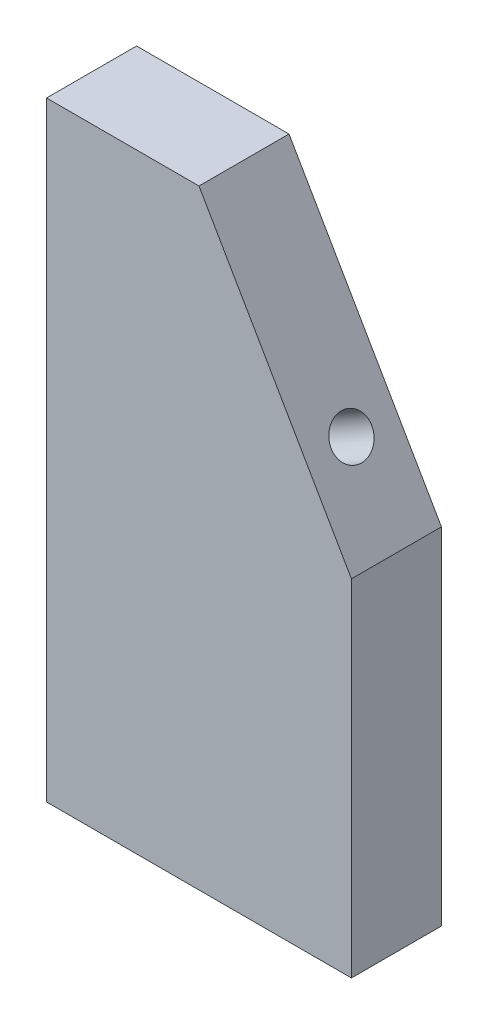
ISO-10303-21;
HEADER;
FILE_DESCRIPTION(('STEP AP214'),'2;1');
FILE_NAME('part.step','',(''),(''),'','','');
FILE_SCHEMA(('AUTOMOTIVE_DESIGN { 1 0 10303 214 1 1 1 1 }'));
ENDSEC;
DATA;
#1=APPLICATION_CONTEXT('core data for automotive mechanical design processes');
#2=APPLICATION_PROTOCOL_DEFINITION('international standard','automotive_design',2000,#1);
#3=PRODUCT_CONTEXT('',#1,'mechanical');
#4=PRODUCT('Part','Part','',(#3));
#5=PRODUCT_RELATED_PRODUCT_CATEGORY('part','',(#4));
#6=PRODUCT_DEFINITION_FORMATION('','',#4);
#7=PRODUCT_DEFINITION_CONTEXT('part definition',#1,'design');
#8=PRODUCT_DEFINITION('design','',#6,#7);
#9=PRODUCT_DEFINITION_SHAPE('','',#8);
#10=(LENGTH_UNIT() NAMED_UNIT(*) SI_UNIT(.MILLI.,.METRE.));
#11=(NAMED_UNIT(*) PLANE_ANGLE_UNIT() SI_UNIT($,.RADIAN.));
#12=(NAMED_UNIT(*) SI_UNIT($,.STERADIAN.) SOLID_ANGLE_UNIT());
#13=UNCERTAINTY_MEASURE_WITH_UNIT(LENGTH_MEASURE(1.E-05),#10,'distance_accuracy_value','');
#14=(GEOMETRIC_REPRESENTATION_CONTEXT(3) GLOBAL_UNCERTAINTY_ASSIGNED_CONTEXT((#13)) GLOBAL_UNIT_ASSIGNED_CONTEXT((#10,
#11,#12)) REPRESENTATION_CONTEXT('',''));
#15=CARTESIAN_POINT('',(0.,0.,0.));
#16=DIRECTION('',(0.,0.,1.));
#17=DIRECTION('',(1.,0.,0.));
#18=AXIS2_PLACEMENT_3D('',#15,#16,#17);
#19=CARTESIAN_POINT('',(-34.7225009252407,-8.10295474387528,-5.85));
#20=DIRECTION('',(0.866025403784439,0.,-0.499999999999998));
#21=DIRECTION('',(-0.499999999999999,0.,-0.86602540378444));
#22=AXIS2_PLACEMENT_3D('',#19,#20,#21);
#23=PLANE('',#22);
#24=DIRECTION('',(0.499999999999999,0.,0.86602540378444));
#25=VECTOR('',#24,1.);
#26=CARTESIAN_POINT('',(-34.7225009252407,-13.8029547438753,-5.85));
#27=LINE('',#26,#25);
#28=CARTESIAN_POINT('',(-34.7225009252407,-13.8029547438753,-5.85));
#29=VERTEX_POINT('',#28);
#30=CARTESIAN_POINT('',(-31.3450018504814,-13.8029547438753,0.));
#31=VERTEX_POINT('',#30);
#32=EDGE_CURVE('E531',#29,#31,#27,.T.);
#33=ORIENTED_EDGE('',*,*,#32,.T.);
#34=DIRECTION('',(0.,-1.,0.));
#35=VECTOR('',#34,1.);
#36=CARTESIAN_POINT('',(-31.3450018504814,-8.10295474387528,0.));
#37=LINE('',#36,#35);
#38=CARTESIAN_POINT('',(-31.3450018504814,-8.10295474387528,0.));
#39=VERTEX_POINT('',#38);
#40=EDGE_CURVE('E530',#39,#31,#37,.T.);
#41=ORIENTED_EDGE('',*,*,#40,.F.);
#42=DIRECTION('',(0.499999999999999,0.,0.86602540378444));
#43=VECTOR('',#42,1.);
#44=CARTESIAN_POINT('',(-34.7225009252407,-8.10295474387528,-5.85));
#45=LINE('',#44,#43);
#46=CARTESIAN_POINT('',(-34.7225009252407,-8.10295474387528,-5.85));
#47=VERTEX_POINT('',#46);
#48=EDGE_CURVE('E505',#47,#39,#45,.T.);
#49=ORIENTED_EDGE('',*,*,#48,.F.);
#50=DIRECTION('',(0.,-1.,0.));
#51=VECTOR('',#50,1.);
#52=CARTESIAN_POINT('',(-34.7225009252407,-8.10295474387528,-5.85));
#53=LINE('',#52,#51);
#54=EDGE_CURVE('E554',#47,#29,#53,.T.);
#55=ORIENTED_EDGE('',*,*,#54,.T.);
#56=EDGE_LOOP('',(#33,#41,#49,#55));
#57=FACE_BOUND('',#56,.T.);
#58=ADVANCED_FACE('F38',(#57),#23,.F.);
#59=CARTESIAN_POINT('',(-41.4774990747593,-8.10295474387528,-5.85));
#60=DIRECTION('',(0.,0.,-1.));
#61=DIRECTION('',(-1.,0.,0.));
#62=AXIS2_PLACEMENT_3D('',#59,#60,#61);
#63=PLANE('',#62);
#64=DIRECTION('',(1.,0.,0.));
#65=VECTOR('',#64,1.);
#66=CARTESIAN_POINT('',(-41.4774990747593,-13.8029547438753,-5.85));
#67=LINE('',#66,#65);
#68=CARTESIAN_POINT('',(-41.4774990747593,-13.8029547438753,-5.85));
#69=VERTEX_POINT('',#68);
#70=EDGE_CURVE('E510',#69,#29,#67,.T.);
#71=ORIENTED_EDGE('',*,*,#70,.T.);
#72=ORIENTED_EDGE('',*,*,#54,.F.);
#73=DIRECTION('',(1.,0.,0.));
#74=VECTOR('',#73,1.);
#75=CARTESIAN_POINT('',(-41.4774990747593,-8.10295474387528,-5.85));
#76=LINE('',#75,#74);
#77=CARTESIAN_POINT('',(-41.4774990747593,-8.10295474387528,-5.85));
#78=VERTEX_POINT('',#77);
#79=EDGE_CURVE('E526',#78,#47,#76,.T.);
#80=ORIENTED_EDGE('',*,*,#79,.F.);
#81=DIRECTION('',(0.,-1.,0.));
#82=VECTOR('',#81,1.);
#83=CARTESIAN_POINT('',(-41.4774990747593,-8.10295474387528,-5.85));
#84=LINE('',#83,#82);
#85=EDGE_CURVE('E559',#78,#69,#84,.T.);
#86=ORIENTED_EDGE('',*,*,#85,.T.);
#87=EDGE_LOOP('',(#71,#72,#80,#86));
#88=FACE_BOUND('',#87,.T.);
#89=ADVANCED_FACE('F161',(#88),#63,.F.);
#90=CARTESIAN_POINT('',(-44.8549981495186,-8.10295474387528,0.));
#91=DIRECTION('',(-0.866025403784438,0.,-0.500000000000001));
#92=DIRECTION('',(-0.500000000000001,0.,0.866025403784438));
#93=AXIS2_PLACEMENT_3D('',#90,#91,#92);
#94=PLANE('',#93);
#95=DIRECTION('',(0.500000000000001,0.,-0.866025403784438));
#96=VECTOR('',#95,1.);
#97=CARTESIAN_POINT('',(-44.8549981495186,-13.8029547438753,0.));
#98=LINE('',#97,#96);
#99=CARTESIAN_POINT('',(-44.8549981495186,-13.8029547438753,0.));
#100=VERTEX_POINT('',#99);
#101=EDGE_CURVE('E547',#100,#69,#98,.T.);
#102=ORIENTED_EDGE('',*,*,#101,.T.);
#103=ORIENTED_EDGE('',*,*,#85,.F.);
#104=DIRECTION('',(0.500000000000001,0.,-0.866025403784438));
#105=VECTOR('',#104,1.);
#106=CARTESIAN_POINT('',(-44.8549981495186,-8.10295474387528,0.));
#107=LINE('',#106,#105);
#108=CARTESIAN_POINT('',(-44.8549981495186,-8.10295474387528,0.));
#109=VERTEX_POINT('',#108);
#110=EDGE_CURVE('E522',#109,#78,#107,.T.);
#111=ORIENTED_EDGE('',*,*,#110,.F.);
#112=DIRECTION('',(0.,-1.,0.));
#113=VECTOR('',#112,1.);
#114=CARTESIAN_POINT('',(-44.8549981495186,-8.10295474387528,0.));
#115=LINE('',#114,#113);
#116=EDGE_CURVE('E563',#109,#100,#115,.T.);
#117=ORIENTED_EDGE('',*,*,#116,.T.);
#118=EDGE_LOOP('',(#102,#103,#111,#117));
#119=FACE_BOUND('',#118,.T.);
#120=ADVANCED_FACE('F167',(#119),#94,.F.);
#121=CARTESIAN_POINT('',(-41.4774990747593,-8.10295474387528,5.84999999999999));
#122=DIRECTION('',(-0.866025403784439,0.,0.499999999999999));
#123=DIRECTION('',(0.499999999999999,0.,0.866025403784439));
#124=AXIS2_PLACEMENT_3D('',#121,#122,#123);
#125=PLANE('',#124);
#126=DIRECTION('',(-0.499999999999999,0.,-0.866025403784439));
#127=VECTOR('',#126,1.);
#128=CARTESIAN_POINT('',(-41.4774990747593,-13.8029547438753,5.84999999999999));
#129=LINE('',#128,#127);
#130=CARTESIAN_POINT('',(-41.4774990747593,-13.8029547438753,5.84999999999999));
#131=VERTEX_POINT('',#130);
#132=EDGE_CURVE('E543',#131,#100,#129,.T.);
#133=ORIENTED_EDGE('',*,*,#132,.T.);
#134=ORIENTED_EDGE('',*,*,#116,.F.);
#135=DIRECTION('',(-0.499999999999999,0.,-0.866025403784439));
#136=VECTOR('',#135,1.);
#137=CARTESIAN_POINT('',(-41.4774990747593,-8.10295474387528,5.84999999999999));
#138=LINE('',#137,#136);
#139=CARTESIAN_POINT('',(-41.4774990747593,-8.10295474387528,5.84999999999999));
#140=VERTEX_POINT('',#139);
#141=EDGE_CURVE('E518',#140,#109,#138,.T.);
#142=ORIENTED_EDGE('',*,*,#141,.F.);
#143=DIRECTION('',(0.,-1.,0.));
#144=VECTOR('',#143,1.);
#145=CARTESIAN_POINT('',(-41.4774990747593,-8.10295474387528,5.84999999999999));
#146=LINE('',#145,#144);
#147=EDGE_CURVE('E567',#140,#131,#146,.T.);
#148=ORIENTED_EDGE('',*,*,#147,.T.);
#149=EDGE_LOOP('',(#133,#134,#142,#148));
#150=FACE_BOUND('',#149,.T.);
#151=ADVANCED_FACE('F405',(#150),#125,.F.);
#152=CARTESIAN_POINT('',(-34.7225009252407,-8.10295474387528,5.85));
#153=DIRECTION('',(0.,0.,1.));
#154=DIRECTION('',(1.,0.,0.));
#155=AXIS2_PLACEMENT_3D('',#152,#153,#154);
#156=PLANE('',#155);
#157=DIRECTION('',(-1.,0.,0.));
#158=VECTOR('',#157,1.);
#159=CARTESIAN_POINT('',(-34.7225009252407,-13.8029547438753,5.85));
#160=LINE('',#159,#158);
#161=CARTESIAN_POINT('',(-34.7225009252407,-13.8029547438753,5.85));
#162=VERTEX_POINT('',#161);
#163=EDGE_CURVE('E539',#162,#131,#160,.T.);
#164=ORIENTED_EDGE('',*,*,#163,.T.);
#165=ORIENTED_EDGE('',*,*,#147,.F.);
#166=DIRECTION('',(-1.,0.,0.));
#167=VECTOR('',#166,1.);
#168=CARTESIAN_POINT('',(-34.7225009252407,-8.10295474387528,5.85));
#169=LINE('',#168,#167);
#170=CARTESIAN_POINT('',(-34.7225009252407,-8.10295474387528,5.85));
#171=VERTEX_POINT('',#170);
#172=EDGE_CURVE('E514',#171,#140,#169,.T.);
#173=ORIENTED_EDGE('',*,*,#172,.F.);
#174=DIRECTION('',(0.,-1.,0.));
#175=VECTOR('',#174,1.);
#176=CARTESIAN_POINT('',(-34.7225009252407,-8.10295474387528,5.85));
#177=LINE('',#176,#175);
#178=EDGE_CURVE('E571',#171,#162,#177,.T.);
#179=ORIENTED_EDGE('',*,*,#178,.T.);
#180=EDGE_LOOP('',(#164,#165,#173,#179));
#181=FACE_BOUND('',#180,.T.);
#182=ADVANCED_FACE('F397',(#181),#156,.F.);
#183=CARTESIAN_POINT('',(-31.3450018504814,-8.10295474387528,0.));
#184=DIRECTION('',(0.866025403784438,0.,0.500000000000001));
#185=DIRECTION('',(0.500000000000001,0.,-0.866025403784438));
#186=AXIS2_PLACEMENT_3D('',#183,#184,#185);
#187=PLANE('',#186);
#188=DIRECTION('',(-0.500000000000001,0.,0.866025403784438));
#189=VECTOR('',#188,1.);
#190=CARTESIAN_POINT('',(-31.3450018504814,-13.8029547438753,0.));
#191=LINE('',#190,#189);
#192=EDGE_CURVE('E534',#31,#162,#191,.T.);
#193=ORIENTED_EDGE('',*,*,#192,.T.);
#194=ORIENTED_EDGE('',*,*,#178,.F.);
#195=DIRECTION('',(-0.500000000000001,0.,0.866025403784438));
#196=VECTOR('',#195,1.);
#197=CARTESIAN_POINT('',(-31.3450018504814,-8.10295474387528,0.));
#198=LINE('',#197,#196);
#199=EDGE_CURVE('E509',#39,#171,#198,.T.);
#200=ORIENTED_EDGE('',*,*,#199,.F.);
#201=ORIENTED_EDGE('',*,*,#40,.T.);
#202=EDGE_LOOP('',(#193,#194,#200,#201));
#203=FACE_BOUND('',#202,.T.);
#204=ADVANCED_FACE('F173',(#203),#187,.F.);
#205=CARTESIAN_POINT('',(0.,-8.10295474387528,0.));
#206=DIRECTION('',(0.,-1.,0.));
#207=DIRECTION('',(0.,0.,-1.));
#208=AXIS2_PLACEMENT_3D('',#205,#206,#207);
#209=PLANE('',#208);
#210=ORIENTED_EDGE('',*,*,#48,.T.);
#211=ORIENTED_EDGE('',*,*,#199,.T.);
#212=ORIENTED_EDGE('',*,*,#172,.T.);
#213=ORIENTED_EDGE('',*,*,#141,.T.);
#214=ORIENTED_EDGE('',*,*,#110,.T.);
#215=ORIENTED_EDGE('',*,*,#79,.T.);
#216=EDGE_LOOP('',(#210,#211,#212,#213,#214,#215));
#217=FACE_BOUND('',#216,.T.);
#218=ADVANCED_FACE('F381',(#217),#209,.T.);
#219=CARTESIAN_POINT('',(0.,-13.8029547438753,0.));
#220=DIRECTION('',(0.,-1.,0.));
#221=DIRECTION('',(0.,0.,-1.));
#222=AXIS2_PLACEMENT_3D('',#219,#220,#221);
#223=PLANE('',#222);
#224=CARTESIAN_POINT('',(-38.1,-13.8029547438753,0.));
#225=DIRECTION('',(0.,1.,0.));
#226=DIRECTION('',(0.,0.,1.));
#227=AXIS2_PLACEMENT_3D('',#224,#225,#226);
#228=CIRCLE('',#227,3.37350099999999);
#229=CARTESIAN_POINT('',(-38.1,-13.8029547438753,3.37350099999999));
#230=VERTEX_POINT('',#229);
#231=EDGE_CURVE('E745',#230,#230,#228,.T.);
#232=ORIENTED_EDGE('',*,*,#231,.F.);
#233=EDGE_LOOP('',(#232));
#234=FACE_BOUND('',#233,.T.);
#235=ORIENTED_EDGE('',*,*,#32,.F.);
#236=ORIENTED_EDGE('',*,*,#70,.F.);
#237=ORIENTED_EDGE('',*,*,#101,.F.);
#238=ORIENTED_EDGE('',*,*,#132,.F.);
#239=ORIENTED_EDGE('',*,*,#163,.F.);
#240=ORIENTED_EDGE('',*,*,#192,.F.);
#241=EDGE_LOOP('',(#235,#236,#237,#238,#239,#240));
#242=FACE_BOUND('',#241,.T.);
#243=ADVANCED_FACE('F356',(#234,#242),#223,.F.);
#244=CARTESIAN_POINT('',(-38.1,-13.8029547438753,0.));
#245=DIRECTION('',(0.,1.,0.));
#246=DIRECTION('',(0.,0.,1.));
#247=AXIS2_PLACEMENT_3D('',#244,#245,#246);
#248=CYLINDRICAL_SURFACE('',#247,3.37350099999999);
#249=CARTESIAN_POINT('',(-38.1,-28.8029547438753,0.));
#250=DIRECTION('',(0.,1.,0.));
#251=DIRECTION('',(0.,0.,1.));
#252=AXIS2_PLACEMENT_3D('',#249,#250,#251);
#253=CIRCLE('',#252,3.37350099999999);
#254=CARTESIAN_POINT('',(-38.1,-28.8029547438753,3.37350099999999));
#255=VERTEX_POINT('',#254);
#256=EDGE_CURVE('E488',#255,#255,#253,.T.);
#257=ORIENTED_EDGE('',*,*,#256,.F.);
#258=EDGE_LOOP('',(#257));
#259=FACE_BOUND('',#258,.T.);
#260=ORIENTED_EDGE('',*,*,#231,.T.);
#261=EDGE_LOOP('',(#260));
#262=FACE_BOUND('',#261,.T.);
#263=ADVANCED_FACE('F351',(#259,#262),#248,.F.);
#264=CARTESIAN_POINT('',(-25.4000000000001,72.7970452561247,7.5));
#265=DIRECTION('',(0.,-1.,0.));
#266=DIRECTION('',(1.,0.,0.));
#267=AXIS2_PLACEMENT_3D('',#264,#265,#266);
#268=PLANE('',#267);
#269=DIRECTION('',(-1.,0.,0.));
#270=VECTOR('',#269,1.);
#271=CARTESIAN_POINT('',(-25.4000000000001,72.7970452561247,-7.5));
#272=LINE('',#271,#270);
#273=CARTESIAN_POINT('',(-25.4000000000001,72.7970452561247,-7.5));
#274=VERTEX_POINT('',#273);
#275=CARTESIAN_POINT('',(-50.8,72.7970452561247,-7.5));
#276=VERTEX_POINT('',#275);
#277=EDGE_CURVE('E121',#274,#276,#272,.T.);
#278=ORIENTED_EDGE('',*,*,#277,.T.);
#279=DIRECTION('',(0.,0.,-1.));
#280=VECTOR('',#279,1.);
#281=CARTESIAN_POINT('',(-50.8,72.7970452561247,7.5));
#282=LINE('',#281,#280);
#283=CARTESIAN_POINT('',(-50.8,72.7970452561247,7.5));
#284=VERTEX_POINT('',#283);
#285=EDGE_CURVE('E11',#284,#276,#282,.T.);
#286=ORIENTED_EDGE('',*,*,#285,.F.);
#287=DIRECTION('',(-1.,0.,0.));
#288=VECTOR('',#287,1.);
#289=CARTESIAN_POINT('',(-25.4000000000001,72.7970452561247,7.5));
#290=LINE('',#289,#288);
#291=CARTESIAN_POINT('',(-25.4000000000001,72.7970452561247,7.5));
#292=VERTEX_POINT('',#291);
#293=EDGE_CURVE('E136',#292,#284,#290,.T.);
#294=ORIENTED_EDGE('',*,*,#293,.F.);
#295=DIRECTION('',(0.,0.,-1.));
#296=VECTOR('',#295,1.);
#297=CARTESIAN_POINT('',(-25.4000000000001,72.7970452561247,7.5));
#298=LINE('',#297,#296);
#299=EDGE_CURVE('E117',#292,#274,#298,.T.);
#300=ORIENTED_EDGE('',*,*,#299,.T.);
#301=EDGE_LOOP('',(#278,#286,#294,#300));
#302=FACE_BOUND('',#301,.T.);
#303=ADVANCED_FACE('F40',(#302),#268,.F.);
#304=CARTESIAN_POINT('',(-50.8,72.7970452561247,7.5));
#305=DIRECTION('',(1.,0.,0.));
#306=DIRECTION('',(0.,1.,0.));
#307=AXIS2_PLACEMENT_3D('',#304,#305,#306);
#308=PLANE('',#307);
#309=DIRECTION('',(0.,-1.,0.));
#310=VECTOR('',#309,1.);
#311=CARTESIAN_POINT('',(-50.8,72.7970452561247,-7.5));
#312=LINE('',#311,#310);
#313=CARTESIAN_POINT('',(-50.8,-28.8029547438753,-7.5));
#314=VERTEX_POINT('',#313);
#315=EDGE_CURVE('E125',#276,#314,#312,.T.);
#316=ORIENTED_EDGE('',*,*,#315,.T.);
#317=DIRECTION('',(0.,0.,-1.));
#318=VECTOR('',#317,1.);
#319=CARTESIAN_POINT('',(-50.8,-28.8029547438753,7.5));
#320=LINE('',#319,#318);
#321=CARTESIAN_POINT('',(-50.8,-28.8029547438753,7.5));
#322=VERTEX_POINT('',#321);
#323=EDGE_CURVE('E48',#322,#314,#320,.T.);
#324=ORIENTED_EDGE('',*,*,#323,.F.);
#325=DIRECTION('',(0.,-1.,0.));
#326=VECTOR('',#325,1.);
#327=CARTESIAN_POINT('',(-50.8,72.7970452561247,7.5));
#328=LINE('',#327,#326);
#329=EDGE_CURVE('E91',#284,#322,#328,.T.);
#330=ORIENTED_EDGE('',*,*,#329,.F.);
#331=ORIENTED_EDGE('',*,*,#285,.T.);
#332=EDGE_LOOP('',(#316,#324,#330,#331));
#333=FACE_BOUND('',#332,.T.);
#334=ADVANCED_FACE('F141',(#333),#308,.F.);
#335=CARTESIAN_POINT('',(-25.4000000000001,-28.8029547438753,7.5));
#336=DIRECTION('',(0.,1.,0.));
#337=DIRECTION('',(0.,0.,1.));
#338=AXIS2_PLACEMENT_3D('',#335,#336,#337);
#339=PLANE('',#338);
#340=ORIENTED_EDGE('',*,*,#256,.T.);
#341=EDGE_LOOP('',(#340));
#342=FACE_BOUND('',#341,.T.);
#343=CARTESIAN_POINT('',(-12.7,-28.8029547438753,0.));
#344=DIRECTION('',(0.,1.,0.));
#345=DIRECTION('',(0.,0.,1.));
#346=AXIS2_PLACEMENT_3D('',#343,#344,#345);
#347=CIRCLE('',#346,3.37350099999999);
#348=CARTESIAN_POINT('',(-12.7,-28.8029547438753,3.37350099999999));
#349=VERTEX_POINT('',#348);
#350=EDGE_CURVE('E491',#349,#349,#347,.T.);
#351=ORIENTED_EDGE('',*,*,#350,.T.);
#352=EDGE_LOOP('',(#351));
#353=FACE_BOUND('',#352,.T.);
#354=DIRECTION('',(1.,0.,0.));
#355=VECTOR('',#354,1.);
#356=CARTESIAN_POINT('',(-25.4000000000001,-28.8029547438753,-7.5));
#357=LINE('',#356,#355);
#358=CARTESIAN_POINT('',(0.,-28.8029547438753,-7.5));
#359=VERTEX_POINT('',#358);
#360=EDGE_CURVE('E109',#314,#359,#357,.T.);
#361=ORIENTED_EDGE('',*,*,#360,.T.);
#362=DIRECTION('',(0.,0.,-1.));
#363=VECTOR('',#362,1.);
#364=CARTESIAN_POINT('',(0.,-28.8029547438753,7.5));
#365=LINE('',#364,#363);
#366=CARTESIAN_POINT('',(0.,-28.8029547438753,7.5));
#367=VERTEX_POINT('',#366);
#368=EDGE_CURVE('E107',#367,#359,#365,.T.);
#369=ORIENTED_EDGE('',*,*,#368,.F.);
#370=DIRECTION('',(1.,0.,0.));
#371=VECTOR('',#370,1.);
#372=CARTESIAN_POINT('',(-50.8,-28.8029547438753,7.5));
#373=LINE('',#372,#371);
#374=EDGE_CURVE('E98',#322,#367,#373,.T.);
#375=ORIENTED_EDGE('',*,*,#374,.F.);
#376=ORIENTED_EDGE('',*,*,#323,.T.);
#377=EDGE_LOOP('',(#361,#369,#375,#376));
#378=FACE_BOUND('',#377,.T.);
#379=ADVANCED_FACE('F108',(#342,#353,#378),#339,.F.);
#380=CARTESIAN_POINT('',(0.,-28.8029547438753,7.5));
#381=DIRECTION('',(-1.,0.,0.));
#382=DIRECTION('',(0.,-1.,0.));
#383=AXIS2_PLACEMENT_3D('',#380,#381,#382);
#384=PLANE('',#383);
#385=DIRECTION('',(0.,1.,0.));
#386=VECTOR('',#385,1.);
#387=CARTESIAN_POINT('',(0.,-28.8029547438753,-7.5));
#388=LINE('',#387,#386);
#389=CARTESIAN_POINT('',(0.,28.8029547438753,-7.5));
#390=VERTEX_POINT('',#389);
#391=EDGE_CURVE('E77',#359,#390,#388,.T.);
#392=ORIENTED_EDGE('',*,*,#391,.T.);
#393=DIRECTION('',(0.,0.,-1.));
#394=VECTOR('',#393,1.);
#395=CARTESIAN_POINT('',(0.,28.8029547438753,7.5));
#396=LINE('',#395,#394);
#397=CARTESIAN_POINT('',(0.,28.8029547438753,7.5));
#398=VERTEX_POINT('',#397);
#399=EDGE_CURVE('E111',#398,#390,#396,.T.);
#400=ORIENTED_EDGE('',*,*,#399,.F.);
#401=DIRECTION('',(0.,1.,0.));
#402=VECTOR('',#401,1.);
#403=CARTESIAN_POINT('',(0.,-28.8029547438753,7.5));
#404=LINE('',#403,#402);
#405=EDGE_CURVE('E102',#367,#398,#404,.T.);
#406=ORIENTED_EDGE('',*,*,#405,.F.);
#407=ORIENTED_EDGE('',*,*,#368,.T.);
#408=EDGE_LOOP('',(#392,#400,#406,#407));
#409=FACE_BOUND('',#408,.T.);
#410=ADVANCED_FACE('F113',(#409),#384,.F.);
#411=CARTESIAN_POINT('',(0.,28.8029547438753,7.5));
#412=DIRECTION('',(-0.866025403784438,-0.500000000000001,0.));
#413=DIRECTION('',(0.500000000000002,-0.866025403784438,0.));
#414=AXIS2_PLACEMENT_3D('',#411,#412,#413);
#415=PLANE('',#414);
#416=CARTESIAN_POINT('',(-7.50000000000003,41.7933358006419,0.));
#417=DIRECTION('',(-0.866025403784438,-0.500000000000001,0.));
#418=DIRECTION('',(0.500000000000002,-0.866025403784438,0.));
#419=AXIS2_PLACEMENT_3D('',#416,#417,#418);
#420=CIRCLE('',#419,3.37350099999999);
#421=CARTESIAN_POINT('',(-5.81324950000003,38.8717982349497,0.));
#422=VERTEX_POINT('',#421);
#423=EDGE_CURVE('E647',#422,#422,#420,.T.);
#424=ORIENTED_EDGE('',*,*,#423,.T.);
#425=EDGE_LOOP('',(#424));
#426=FACE_BOUND('',#425,.T.);
#427=DIRECTION('',(-0.500000000000002,0.866025403784438,0.));
#428=VECTOR('',#427,1.);
#429=CARTESIAN_POINT('',(0.,28.8029547438753,-7.5));
#430=LINE('',#429,#428);
#431=EDGE_CURVE('E83',#390,#274,#430,.T.);
#432=ORIENTED_EDGE('',*,*,#431,.T.);
#433=ORIENTED_EDGE('',*,*,#299,.F.);
#434=DIRECTION('',(-0.500000000000002,0.866025403784438,0.));
#435=VECTOR('',#434,1.);
#436=CARTESIAN_POINT('',(0.,28.8029547438753,7.5));
#437=LINE('',#436,#435);
#438=EDGE_CURVE('E56',#398,#292,#437,.T.);
#439=ORIENTED_EDGE('',*,*,#438,.F.);
#440=ORIENTED_EDGE('',*,*,#399,.T.);
#441=EDGE_LOOP('',(#432,#433,#439,#440));
#442=FACE_BOUND('',#441,.T.);
#443=ADVANCED_FACE('F148',(#426,#442),#415,.F.);
#444=CARTESIAN_POINT('',(0.,0.,7.5));
#445=DIRECTION('',(0.,0.,1.));
#446=DIRECTION('',(1.,0.,0.));
#447=AXIS2_PLACEMENT_3D('',#444,#445,#446);
#448=PLANE('',#447);
#449=ORIENTED_EDGE('',*,*,#293,.T.);
#450=ORIENTED_EDGE('',*,*,#329,.T.);
#451=ORIENTED_EDGE('',*,*,#374,.T.);
#452=ORIENTED_EDGE('',*,*,#405,.T.);
#453=ORIENTED_EDGE('',*,*,#438,.T.);
#454=EDGE_LOOP('',(#449,#450,#451,#452,#453));
#455=FACE_BOUND('',#454,.T.);
#456=ADVANCED_FACE('F100',(#455),#448,.T.);
#457=CARTESIAN_POINT('',(0.,0.,-7.5));
#458=DIRECTION('',(0.,0.,1.));
#459=DIRECTION('',(1.,0.,0.));
#460=AXIS2_PLACEMENT_3D('',#457,#458,#459);
#461=PLANE('',#460);
#462=ORIENTED_EDGE('',*,*,#277,.F.);
#463=ORIENTED_EDGE('',*,*,#431,.F.);
#464=ORIENTED_EDGE('',*,*,#391,.F.);
#465=ORIENTED_EDGE('',*,*,#360,.F.);
#466=ORIENTED_EDGE('',*,*,#315,.F.);
#467=EDGE_LOOP('',(#462,#463,#464,#465,#466));
#468=FACE_BOUND('',#467,.T.);
#469=ADVANCED_FACE('F145',(#468),#461,.F.);
#470=CARTESIAN_POINT('',(-16.1602540378443,36.7933358006419,0.));
#471=DIRECTION('',(-0.866025403784438,-0.500000000000001,0.));
#472=DIRECTION('',(0.500000000000001,-0.866025403784438,0.));
#473=AXIS2_PLACEMENT_3D('',#470,#471,#472);
#474=CYLINDRICAL_SURFACE('',#473,3.37350099999999);
#475=CARTESIAN_POINT('',(-16.1602540378443,36.7933358006419,0.));
#476=DIRECTION('',(-0.866025403784438,-0.500000000000001,0.));
#477=DIRECTION('',(0.500000000000001,-0.866025403784438,0.));
#478=AXIS2_PLACEMENT_3D('',#475,#476,#477);
#479=CIRCLE('',#478,3.373501);
#480=CARTESIAN_POINT('',(-14.4735035378443,33.8717982349497,0.));
#481=VERTEX_POINT('',#480);
#482=EDGE_CURVE('E558',#481,#481,#479,.T.);
#483=ORIENTED_EDGE('',*,*,#482,.T.);
#484=EDGE_LOOP('',(#483));
#485=FACE_BOUND('',#484,.T.);
#486=ORIENTED_EDGE('',*,*,#423,.F.);
#487=EDGE_LOOP('',(#486));
#488=FACE_BOUND('',#487,.T.);
#489=ADVANCED_FACE('F209',(#485,#488),#474,.F.);
#490=CARTESIAN_POINT('',(-24.0410852122828,39.0433358006418,-5.1));
#491=DIRECTION('',(0.,0.,-1.));
#492=DIRECTION('',(-1.,0.,0.));
#493=AXIS2_PLACEMENT_3D('',#490,#491,#492);
#494=PLANE('',#493);
#495=DIRECTION('',(-0.500000000000003,0.866025403784437,0.));
#496=VECTOR('',#495,1.);
#497=CARTESIAN_POINT('',(-19.1047404107115,41.8933358006419,-5.1));
#498=LINE('',#497,#496);
#499=CARTESIAN_POINT('',(-14.6880108514108,34.2433358006419,-5.1));
#500=VERTEX_POINT('',#499);
#501=CARTESIAN_POINT('',(-19.1047404107115,41.8933358006419,-5.1));
#502=VERTEX_POINT('',#501);
#503=EDGE_CURVE('E684',#500,#502,#498,.T.);
#504=ORIENTED_EDGE('',*,*,#503,.T.);
#505=DIRECTION('',(1.,0.,0.));
#506=VECTOR('',#505,1.);
#507=CARTESIAN_POINT('',(-19.1047404107115,41.8933358006419,-5.1));
#508=LINE('',#507,#506);
#509=CARTESIAN_POINT('',(-24.0410852122828,41.8933358006419,-5.1));
#510=VERTEX_POINT('',#509);
#511=EDGE_CURVE('E730',#510,#502,#508,.T.);
#512=ORIENTED_EDGE('',*,*,#511,.F.);
#513=DIRECTION('',(0.,1.,0.));
#514=VECTOR('',#513,1.);
#515=CARTESIAN_POINT('',(-24.0410852122828,41.8933358006419,-5.1));
#516=LINE('',#515,#514);
#517=CARTESIAN_POINT('',(-24.0410852122828,39.0433358006418,-5.1));
#518=VERTEX_POINT('',#517);
#519=EDGE_CURVE('E736',#518,#510,#516,.T.);
#520=ORIENTED_EDGE('',*,*,#519,.F.);
#521=DIRECTION('',(-0.500000000000001,0.866025403784438,0.));
#522=VECTOR('',#521,1.);
#523=CARTESIAN_POINT('',(-19.6243556529821,31.3933358006419,-5.1));
#524=LINE('',#523,#522);
#525=CARTESIAN_POINT('',(-19.6243556529821,31.3933358006419,-5.1));
#526=VERTEX_POINT('',#525);
#527=EDGE_CURVE('E668',#526,#518,#524,.T.);
#528=ORIENTED_EDGE('',*,*,#527,.F.);
#529=DIRECTION('',(0.866025403784438,0.500000000000001,0.));
#530=VECTOR('',#529,1.);
#531=CARTESIAN_POINT('',(-19.6243556529821,31.3933358006419,-5.1));
#532=LINE('',#531,#530);
#533=EDGE_CURVE('E126',#526,#500,#532,.T.);
#534=ORIENTED_EDGE('',*,*,#533,.T.);
#535=EDGE_LOOP('',(#504,#512,#520,#528,#534));
#536=FACE_BOUND('',#535,.T.);
#537=ADVANCED_FACE('F212',(#536),#494,.F.);
#538=CARTESIAN_POINT('',(-18.1521124665486,28.8433358006418,0.));
#539=DIRECTION('',(0.43301270189222,-0.749999999999999,-0.500000000000001));
#540=DIRECTION('',(0.,0.55470019622523,-0.832050294337843));
#541=AXIS2_PLACEMENT_3D('',#538,#539,#540);
#542=PLANE('',#541);
#543=DIRECTION('',(-0.250000000000001,0.43301270189222,-0.866025403784438));
#544=VECTOR('',#543,1.);
#545=CARTESIAN_POINT('',(-13.2157676649773,31.6933358006419,0.));
#546=LINE('',#545,#544);
#547=CARTESIAN_POINT('',(-13.2157676649773,31.6933358006419,0.));
#548=VERTEX_POINT('',#547);
#549=EDGE_CURVE('E680',#548,#500,#546,.T.);
#550=ORIENTED_EDGE('',*,*,#549,.T.);
#551=ORIENTED_EDGE('',*,*,#533,.F.);
#552=DIRECTION('',(-0.250000000000001,0.43301270189222,-0.866025403784438));
#553=VECTOR('',#552,1.);
#554=CARTESIAN_POINT('',(-18.1521124665486,28.8433358006418,0.));
#555=LINE('',#554,#553);
#556=CARTESIAN_POINT('',(-18.1521124665486,28.8433358006418,0.));
#557=VERTEX_POINT('',#556);
#558=EDGE_CURVE('E664',#557,#526,#555,.T.);
#559=ORIENTED_EDGE('',*,*,#558,.F.);
#560=DIRECTION('',(0.866025403784438,0.500000000000001,0.));
#561=VECTOR('',#560,1.);
#562=CARTESIAN_POINT('',(-18.1521124665486,28.8433358006418,0.));
#563=LINE('',#562,#561);
#564=EDGE_CURVE('E694',#557,#548,#563,.T.);
#565=ORIENTED_EDGE('',*,*,#564,.T.);
#566=EDGE_LOOP('',(#550,#551,#559,#565));
#567=FACE_BOUND('',#566,.T.);
#568=ADVANCED_FACE('F225',(#567),#542,.F.);
#569=CARTESIAN_POINT('',(-19.6243556529821,31.3933358006418,5.1));
#570=DIRECTION('',(0.43301270189222,-0.749999999999999,0.5));
#571=DIRECTION('',(0.,-0.554700196225229,-0.832050294337843));
#572=AXIS2_PLACEMENT_3D('',#569,#570,#571);
#573=PLANE('',#572);
#574=DIRECTION('',(0.25,-0.433012701892219,-0.866025403784439));
#575=VECTOR('',#574,1.);
#576=CARTESIAN_POINT('',(-14.6880108514108,34.2433358006419,5.1));
#577=LINE('',#576,#575);
#578=CARTESIAN_POINT('',(-14.6880108514108,34.2433358006419,5.1));
#579=VERTEX_POINT('',#578);
#580=EDGE_CURVE('E676',#579,#548,#577,.T.);
#581=ORIENTED_EDGE('',*,*,#580,.T.);
#582=ORIENTED_EDGE('',*,*,#564,.F.);
#583=DIRECTION('',(0.25,-0.433012701892219,-0.866025403784439));
#584=VECTOR('',#583,1.);
#585=CARTESIAN_POINT('',(-19.6243556529821,31.3933358006418,5.1));
#586=LINE('',#585,#584);
#587=CARTESIAN_POINT('',(-19.6243556529821,31.3933358006418,5.1));
#588=VERTEX_POINT('',#587);
#589=EDGE_CURVE('E660',#588,#557,#586,.T.);
#590=ORIENTED_EDGE('',*,*,#589,.F.);
#591=DIRECTION('',(0.866025403784438,0.500000000000001,0.));
#592=VECTOR('',#591,1.);
#593=CARTESIAN_POINT('',(-19.6243556529821,31.3933358006418,5.1));
#594=LINE('',#593,#592);
#595=EDGE_CURVE('E672',#588,#579,#594,.T.);
#596=ORIENTED_EDGE('',*,*,#595,.T.);
#597=EDGE_LOOP('',(#581,#582,#590,#596));
#598=FACE_BOUND('',#597,.T.);
#599=ADVANCED_FACE('F229',(#598),#573,.F.);
#600=CARTESIAN_POINT('',(-22.5688420258492,36.4933358006418,5.1));
#601=DIRECTION('',(0.,0.,1.));
#602=DIRECTION('',(0.,-1.,0.));
#603=AXIS2_PLACEMENT_3D('',#600,#601,#602);
#604=PLANE('',#603);
#605=DIRECTION('',(0.500000000000001,-0.866025403784438,0.));
#606=VECTOR('',#605,1.);
#607=CARTESIAN_POINT('',(-17.6324972242779,39.3433358006419,5.1));
#608=LINE('',#607,#606);
#609=CARTESIAN_POINT('',(-19.1047404107115,41.8933358006419,5.1));
#610=VERTEX_POINT('',#609);
#611=EDGE_CURVE('E650',#610,#579,#608,.T.);
#612=ORIENTED_EDGE('',*,*,#611,.T.);
#613=ORIENTED_EDGE('',*,*,#595,.F.);
#614=DIRECTION('',(0.500000000000002,-0.866025403784438,0.));
#615=VECTOR('',#614,1.);
#616=CARTESIAN_POINT('',(-22.5688420258492,36.4933358006418,5.1));
#617=LINE('',#616,#615);
#618=CARTESIAN_POINT('',(-24.0410852122828,39.0433358006418,5.1));
#619=VERTEX_POINT('',#618);
#620=EDGE_CURVE('E655',#619,#588,#617,.T.);
#621=ORIENTED_EDGE('',*,*,#620,.F.);
#622=DIRECTION('',(0.,1.,0.));
#623=VECTOR('',#622,1.);
#624=CARTESIAN_POINT('',(-24.0410852122828,41.8933358006419,5.10000000000001));
#625=LINE('',#624,#623);
#626=CARTESIAN_POINT('',(-24.0410852122828,41.8933358006419,5.10000000000001));
#627=VERTEX_POINT('',#626);
#628=EDGE_CURVE('E725',#619,#627,#625,.T.);
#629=ORIENTED_EDGE('',*,*,#628,.T.);
#630=DIRECTION('',(1.,0.,0.));
#631=VECTOR('',#630,1.);
#632=CARTESIAN_POINT('',(-19.1047404107115,41.8933358006419,5.1));
#633=LINE('',#632,#631);
#634=EDGE_CURVE('E722',#627,#610,#633,.T.);
#635=ORIENTED_EDGE('',*,*,#634,.T.);
#636=EDGE_LOOP('',(#612,#613,#621,#629,#635));
#637=FACE_BOUND('',#636,.T.);
#638=ADVANCED_FACE('F218',(#637),#604,.F.);
#639=CARTESIAN_POINT('',(-1.12455358329082,-0.649261314031087,0.));
#640=DIRECTION('',(-0.866025403784437,-0.500000000000003,0.));
#641=DIRECTION('',(0.500000000000003,-0.866025403784437,0.));
#642=AXIS2_PLACEMENT_3D('',#639,#640,#641);
#643=PLANE('',#642);
#644=DIRECTION('',(0.,0.,1.));
#645=VECTOR('',#644,1.);
#646=CARTESIAN_POINT('',(-24.0410852122828,39.0433358006418,5.09999999999999));
#647=LINE('',#646,#645);
#648=EDGE_CURVE('E651',#518,#619,#647,.T.);
#649=ORIENTED_EDGE('',*,*,#648,.T.);
#650=ORIENTED_EDGE('',*,*,#620,.T.);
#651=ORIENTED_EDGE('',*,*,#589,.T.);
#652=ORIENTED_EDGE('',*,*,#558,.T.);
#653=ORIENTED_EDGE('',*,*,#527,.T.);
#654=EDGE_LOOP('',(#649,#650,#651,#652,#653));
#655=FACE_BOUND('',#654,.T.);
#656=ADVANCED_FACE('F214',(#655),#643,.F.);
#657=CARTESIAN_POINT('',(3.81179121828047,2.20073868596892,0.));
#658=DIRECTION('',(-0.866025403784437,-0.500000000000003,0.));
#659=DIRECTION('',(0.500000000000003,-0.866025403784437,0.));
#660=AXIS2_PLACEMENT_3D('',#657,#658,#659);
#661=PLANE('',#660);
#662=ORIENTED_EDGE('',*,*,#482,.F.);
#663=EDGE_LOOP('',(#662));
#664=FACE_BOUND('',#663,.T.);
#665=DIRECTION('',(0.,0.,1.));
#666=VECTOR('',#665,1.);
#667=CARTESIAN_POINT('',(-19.1047404107115,41.8933358006419,0.));
#668=LINE('',#667,#666);
#669=EDGE_CURVE('E656',#502,#610,#668,.T.);
#670=ORIENTED_EDGE('',*,*,#669,.F.);
#671=ORIENTED_EDGE('',*,*,#503,.F.);
#672=ORIENTED_EDGE('',*,*,#549,.F.);
#673=ORIENTED_EDGE('',*,*,#580,.F.);
#674=ORIENTED_EDGE('',*,*,#611,.F.);
#675=EDGE_LOOP('',(#670,#671,#672,#673,#674));
#676=FACE_BOUND('',#675,.T.);
#677=ADVANCED_FACE('F217',(#664,#676),#661,.T.);
#678=CARTESIAN_POINT('',(-12.7,-13.8029547438753,0.));
#679=DIRECTION('',(0.,1.,0.));
#680=DIRECTION('',(0.,0.,1.));
#681=AXIS2_PLACEMENT_3D('',#678,#679,#680);
#682=CYLINDRICAL_SURFACE('',#681,3.37350099999999);
#683=ORIENTED_EDGE('',*,*,#350,.F.);
#684=EDGE_LOOP('',(#683));
#685=FACE_BOUND('',#684,.T.);
#686=CARTESIAN_POINT('',(-12.7,-13.8029547438753,0.));
#687=DIRECTION('',(0.,1.,0.));
#688=DIRECTION('',(0.,0.,1.));
#689=AXIS2_PLACEMENT_3D('',#686,#687,#688);
#690=CIRCLE('',#689,3.37350099999999);
#691=CARTESIAN_POINT('',(-12.7,-13.8029547438753,3.37350099999998));
#692=VERTEX_POINT('',#691);
#693=EDGE_CURVE('E494',#692,#692,#690,.T.);
#694=ORIENTED_EDGE('',*,*,#693,.T.);
#695=EDGE_LOOP('',(#694));
#696=FACE_BOUND('',#695,.T.);
#697=ADVANCED_FACE('F185',(#685,#696),#682,.F.);
#698=CARTESIAN_POINT('',(0.,-13.8029547438753,0.));
#699=DIRECTION('',(0.,-1.,0.));
#700=DIRECTION('',(0.,0.,-1.));
#701=AXIS2_PLACEMENT_3D('',#698,#699,#700);
#702=PLANE('',#701);
#703=DIRECTION('',(-0.5,0.,0.866025403784439));
#704=VECTOR('',#703,1.);
#705=CARTESIAN_POINT('',(-5.94500185048138,-13.8029547438753,0.));
#706=LINE('',#705,#704);
#707=CARTESIAN_POINT('',(-5.94500185048138,-13.8029547438753,0.));
#708=VERTEX_POINT('',#707);
#709=CARTESIAN_POINT('',(-9.32250092524069,-13.8029547438753,5.85));
#710=VERTEX_POINT('',#709);
#711=EDGE_CURVE('E493',#708,#710,#706,.T.);
#712=ORIENTED_EDGE('',*,*,#711,.F.);
#713=DIRECTION('',(0.5,0.,0.866025403784439));
#714=VECTOR('',#713,1.);
#715=CARTESIAN_POINT('',(-9.32250092524069,-13.8029547438753,-5.85));
#716=LINE('',#715,#714);
#717=CARTESIAN_POINT('',(-9.32250092524069,-13.8029547438753,-5.85));
#718=VERTEX_POINT('',#717);
#719=EDGE_CURVE('E583',#718,#708,#716,.T.);
#720=ORIENTED_EDGE('',*,*,#719,.F.);
#721=DIRECTION('',(1.,0.,0.));
#722=VECTOR('',#721,1.);
#723=CARTESIAN_POINT('',(-16.0774990747593,-13.8029547438753,-5.85));
#724=LINE('',#723,#722);
#725=CARTESIAN_POINT('',(-16.0774990747593,-13.8029547438753,-5.85));
#726=VERTEX_POINT('',#725);
#727=EDGE_CURVE('E615',#726,#718,#724,.T.);
#728=ORIENTED_EDGE('',*,*,#727,.F.);
#729=DIRECTION('',(0.5,0.,-0.866025403784439));
#730=VECTOR('',#729,1.);
#731=CARTESIAN_POINT('',(-19.4549981495186,-13.8029547438753,0.));
#732=LINE('',#731,#730);
#733=CARTESIAN_POINT('',(-19.4549981495186,-13.8029547438753,0.));
#734=VERTEX_POINT('',#733);
#735=EDGE_CURVE('E611',#734,#726,#732,.T.);
#736=ORIENTED_EDGE('',*,*,#735,.F.);
#737=DIRECTION('',(-0.499999999999999,0.,-0.866025403784439));
#738=VECTOR('',#737,1.);
#739=CARTESIAN_POINT('',(-16.0774990747593,-13.8029547438753,5.85));
#740=LINE('',#739,#738);
#741=CARTESIAN_POINT('',(-16.0774990747593,-13.8029547438753,5.85));
#742=VERTEX_POINT('',#741);
#743=EDGE_CURVE('E607',#742,#734,#740,.T.);
#744=ORIENTED_EDGE('',*,*,#743,.F.);
#745=DIRECTION('',(-1.,0.,0.));
#746=VECTOR('',#745,1.);
#747=CARTESIAN_POINT('',(-9.32250092524069,-13.8029547438753,5.85));
#748=LINE('',#747,#746);
#749=EDGE_CURVE('E499',#710,#742,#748,.T.);
#750=ORIENTED_EDGE('',*,*,#749,.F.);
#751=EDGE_LOOP('',(#712,#720,#728,#736,#744,#750));
#752=FACE_BOUND('',#751,.T.);
#753=ORIENTED_EDGE('',*,*,#693,.F.);
#754=EDGE_LOOP('',(#753));
#755=FACE_BOUND('',#754,.T.);
#756=ADVANCED_FACE('F181',(#752,#755),#702,.F.);
#757=CARTESIAN_POINT('',(-5.94500185048138,-8.10295474387528,0.));
#758=DIRECTION('',(0.866025403784439,0.,0.5));
#759=DIRECTION('',(0.5,0.,-0.866025403784439));
#760=AXIS2_PLACEMENT_3D('',#757,#758,#759);
#761=PLANE('',#760);
#762=ORIENTED_EDGE('',*,*,#711,.T.);
#763=DIRECTION('',(0.,-1.,0.));
#764=VECTOR('',#763,1.);
#765=CARTESIAN_POINT('',(-9.32250092524069,-8.10295474387528,5.85));
#766=LINE('',#765,#764);
#767=CARTESIAN_POINT('',(-9.32250092524069,-8.10295474387528,5.85));
#768=VERTEX_POINT('',#767);
#769=EDGE_CURVE('E602',#768,#710,#766,.T.);
#770=ORIENTED_EDGE('',*,*,#769,.F.);
#771=DIRECTION('',(-0.5,0.,0.866025403784439));
#772=VECTOR('',#771,1.);
#773=CARTESIAN_POINT('',(-5.94500185048138,-8.10295474387528,0.));
#774=LINE('',#773,#772);
#775=CARTESIAN_POINT('',(-5.94500185048138,-8.10295474387528,0.));
#776=VERTEX_POINT('',#775);
#777=EDGE_CURVE('E578',#776,#768,#774,.T.);
#778=ORIENTED_EDGE('',*,*,#777,.F.);
#779=DIRECTION('',(0.,-1.,0.));
#780=VECTOR('',#779,1.);
#781=CARTESIAN_POINT('',(-5.94500185048138,-8.10295474387528,0.));
#782=LINE('',#781,#780);
#783=EDGE_CURVE('E535',#776,#708,#782,.T.);
#784=ORIENTED_EDGE('',*,*,#783,.T.);
#785=EDGE_LOOP('',(#762,#770,#778,#784));
#786=FACE_BOUND('',#785,.T.);
#787=ADVANCED_FACE('F184',(#786),#761,.F.);
#788=CARTESIAN_POINT('',(-9.32250092524069,-8.10295474387528,-5.85));
#789=DIRECTION('',(0.866025403784439,0.,-0.5));
#790=DIRECTION('',(-0.5,0.,-0.866025403784439));
#791=AXIS2_PLACEMENT_3D('',#788,#789,#790);
#792=PLANE('',#791);
#793=ORIENTED_EDGE('',*,*,#719,.T.);
#794=ORIENTED_EDGE('',*,*,#783,.F.);
#795=DIRECTION('',(0.5,0.,0.866025403784439));
#796=VECTOR('',#795,1.);
#797=CARTESIAN_POINT('',(-9.32250092524069,-8.10295474387528,-5.85));
#798=LINE('',#797,#796);
#799=CARTESIAN_POINT('',(-9.32250092524069,-8.10295474387528,-5.85));
#800=VERTEX_POINT('',#799);
#801=EDGE_CURVE('E599',#800,#776,#798,.T.);
#802=ORIENTED_EDGE('',*,*,#801,.F.);
#803=DIRECTION('',(0.,-1.,0.));
#804=VECTOR('',#803,1.);
#805=CARTESIAN_POINT('',(-9.32250092524069,-8.10295474387528,-5.85));
#806=LINE('',#805,#804);
#807=EDGE_CURVE('E625',#800,#718,#806,.T.);
#808=ORIENTED_EDGE('',*,*,#807,.T.);
#809=EDGE_LOOP('',(#793,#794,#802,#808));
#810=FACE_BOUND('',#809,.T.);
#811=ADVANCED_FACE('F187',(#810),#792,.F.);
#812=CARTESIAN_POINT('',(-16.0774990747593,-8.10295474387528,-5.85));
#813=DIRECTION('',(0.,0.,-1.));
#814=DIRECTION('',(-1.,0.,0.));
#815=AXIS2_PLACEMENT_3D('',#812,#813,#814);
#816=PLANE('',#815);
#817=ORIENTED_EDGE('',*,*,#727,.T.);
#818=ORIENTED_EDGE('',*,*,#807,.F.);
#819=DIRECTION('',(1.,0.,0.));
#820=VECTOR('',#819,1.);
#821=CARTESIAN_POINT('',(-16.0774990747593,-8.10295474387528,-5.85));
#822=LINE('',#821,#820);
#823=CARTESIAN_POINT('',(-16.0774990747593,-8.10295474387528,-5.85));
#824=VERTEX_POINT('',#823);
#825=EDGE_CURVE('E595',#824,#800,#822,.T.);
#826=ORIENTED_EDGE('',*,*,#825,.F.);
#827=DIRECTION('',(0.,-1.,0.));
#828=VECTOR('',#827,1.);
#829=CARTESIAN_POINT('',(-16.0774990747593,-8.10295474387528,-5.85));
#830=LINE('',#829,#828);
#831=EDGE_CURVE('E629',#824,#726,#830,.T.);
#832=ORIENTED_EDGE('',*,*,#831,.T.);
#833=EDGE_LOOP('',(#817,#818,#826,#832));
#834=FACE_BOUND('',#833,.T.);
#835=ADVANCED_FACE('F190',(#834),#816,.F.);
#836=CARTESIAN_POINT('',(-19.4549981495186,-8.10295474387528,0.));
#837=DIRECTION('',(-0.866025403784439,0.,-0.5));
#838=DIRECTION('',(-0.5,0.,0.866025403784439));
#839=AXIS2_PLACEMENT_3D('',#836,#837,#838);
#840=PLANE('',#839);
#841=ORIENTED_EDGE('',*,*,#735,.T.);
#842=ORIENTED_EDGE('',*,*,#831,.F.);
#843=DIRECTION('',(0.5,0.,-0.866025403784439));
#844=VECTOR('',#843,1.);
#845=CARTESIAN_POINT('',(-19.4549981495186,-8.10295474387528,0.));
#846=LINE('',#845,#844);
#847=CARTESIAN_POINT('',(-19.4549981495186,-8.10295474387528,0.));
#848=VERTEX_POINT('',#847);
#849=EDGE_CURVE('E591',#848,#824,#846,.T.);
#850=ORIENTED_EDGE('',*,*,#849,.F.);
#851=DIRECTION('',(0.,-1.,0.));
#852=VECTOR('',#851,1.);
#853=CARTESIAN_POINT('',(-19.4549981495186,-8.10295474387528,0.));
#854=LINE('',#853,#852);
#855=EDGE_CURVE('E633',#848,#734,#854,.T.);
#856=ORIENTED_EDGE('',*,*,#855,.T.);
#857=EDGE_LOOP('',(#841,#842,#850,#856));
#858=FACE_BOUND('',#857,.T.);
#859=ADVANCED_FACE('F194',(#858),#840,.F.);
#860=CARTESIAN_POINT('',(-16.0774990747593,-8.10295474387528,5.85));
#861=DIRECTION('',(-0.866025403784439,0.,0.499999999999999));
#862=DIRECTION('',(0.499999999999999,0.,0.866025403784439));
#863=AXIS2_PLACEMENT_3D('',#860,#861,#862);
#864=PLANE('',#863);
#865=ORIENTED_EDGE('',*,*,#743,.T.);
#866=ORIENTED_EDGE('',*,*,#855,.F.);
#867=DIRECTION('',(-0.499999999999999,0.,-0.866025403784439));
#868=VECTOR('',#867,1.);
#869=CARTESIAN_POINT('',(-16.0774990747593,-8.10295474387528,5.85));
#870=LINE('',#869,#868);
#871=CARTESIAN_POINT('',(-16.0774990747593,-8.10295474387528,5.85));
#872=VERTEX_POINT('',#871);
#873=EDGE_CURVE('E587',#872,#848,#870,.T.);
#874=ORIENTED_EDGE('',*,*,#873,.F.);
#875=DIRECTION('',(0.,-1.,0.));
#876=VECTOR('',#875,1.);
#877=CARTESIAN_POINT('',(-16.0774990747593,-8.10295474387528,5.85));
#878=LINE('',#877,#876);
#879=EDGE_CURVE('E637',#872,#742,#878,.T.);
#880=ORIENTED_EDGE('',*,*,#879,.T.);
#881=EDGE_LOOP('',(#865,#866,#874,#880));
#882=FACE_BOUND('',#881,.T.);
#883=ADVANCED_FACE('F198',(#882),#864,.F.);
#884=CARTESIAN_POINT('',(-9.32250092524069,-8.10295474387528,5.85));
#885=DIRECTION('',(0.,0.,1.));
#886=DIRECTION('',(1.,0.,0.));
#887=AXIS2_PLACEMENT_3D('',#884,#885,#886);
#888=PLANE('',#887);
#889=ORIENTED_EDGE('',*,*,#749,.T.);
#890=ORIENTED_EDGE('',*,*,#879,.F.);
#891=DIRECTION('',(-1.,0.,0.));
#892=VECTOR('',#891,1.);
#893=CARTESIAN_POINT('',(-9.32250092524069,-8.10295474387528,5.85));
#894=LINE('',#893,#892);
#895=EDGE_CURVE('E582',#768,#872,#894,.T.);
#896=ORIENTED_EDGE('',*,*,#895,.F.);
#897=ORIENTED_EDGE('',*,*,#769,.T.);
#898=EDGE_LOOP('',(#889,#890,#896,#897));
#899=FACE_BOUND('',#898,.T.);
#900=ADVANCED_FACE('F179',(#899),#888,.F.);
#901=CARTESIAN_POINT('',(0.,-8.10295474387528,0.));
#902=DIRECTION('',(0.,-1.,0.));
#903=DIRECTION('',(0.,0.,-1.));
#904=AXIS2_PLACEMENT_3D('',#901,#902,#903);
#905=PLANE('',#904);
#906=ORIENTED_EDGE('',*,*,#777,.T.);
#907=ORIENTED_EDGE('',*,*,#895,.T.);
#908=ORIENTED_EDGE('',*,*,#873,.T.);
#909=ORIENTED_EDGE('',*,*,#849,.T.);
#910=ORIENTED_EDGE('',*,*,#825,.T.);
#911=ORIENTED_EDGE('',*,*,#801,.T.);
#912=EDGE_LOOP('',(#906,#907,#908,#909,#910,#911));
#913=FACE_BOUND('',#912,.T.);
#914=ADVANCED_FACE('F175',(#913),#905,.T.);
#915=CARTESIAN_POINT('',(-24.0410852122828,41.8933358006419,-10.8));
#916=DIRECTION('',(1.,0.,0.));
#917=DIRECTION('',(0.,0.,-1.));
#918=AXIS2_PLACEMENT_3D('',#915,#916,#917);
#919=PLANE('',#918);
#920=ORIENTED_EDGE('',*,*,#519,.T.);
#921=DIRECTION('',(0.,0.,1.));
#922=VECTOR('',#921,1.);
#923=CARTESIAN_POINT('',(-24.0410852122828,41.8933358006419,-10.8));
#924=LINE('',#923,#922);
#925=EDGE_CURVE('E731',#510,#627,#924,.T.);
#926=ORIENTED_EDGE('',*,*,#925,.T.);
#927=ORIENTED_EDGE('',*,*,#628,.F.);
#928=ORIENTED_EDGE('',*,*,#648,.F.);
#929=EDGE_LOOP('',(#920,#926,#927,#928));
#930=FACE_BOUND('',#929,.T.);
#931=ADVANCED_FACE('F178',(#930),#919,.T.);
#932=CARTESIAN_POINT('',(-19.1047404107115,41.8933358006419,-10.8));
#933=DIRECTION('',(0.,-1.,0.));
#934=DIRECTION('',(0.,0.,-1.));
#935=AXIS2_PLACEMENT_3D('',#932,#933,#934);
#936=PLANE('',#935);
#937=ORIENTED_EDGE('',*,*,#511,.T.);
#938=ORIENTED_EDGE('',*,*,#669,.T.);
#939=ORIENTED_EDGE('',*,*,#634,.F.);
#940=ORIENTED_EDGE('',*,*,#925,.F.);
#941=EDGE_LOOP('',(#937,#938,#939,#940));
#942=FACE_BOUND('',#941,.T.);
#943=ADVANCED_FACE('F322',(#942),#936,.T.);
#944=CLOSED_SHELL('',(#58,#89,#120,#151,#182,#204,#218,#243,#263,#303,#334,#379,#410,#443,#456,
#469,#489,#537,#568,#599,#638,#656,#677,#697,#756,#787,#811,#835,#859,#883,#900,#914,#931,#943));
#945=MANIFOLD_SOLID_BREP('B2',#944);
#946=ADVANCED_BREP_SHAPE_REPRESENTATION('',(#18,#945),#14);
#947=SHAPE_DEFINITION_REPRESENTATION(#9,#946);
ENDSEC;
END-ISO-10303-21;
